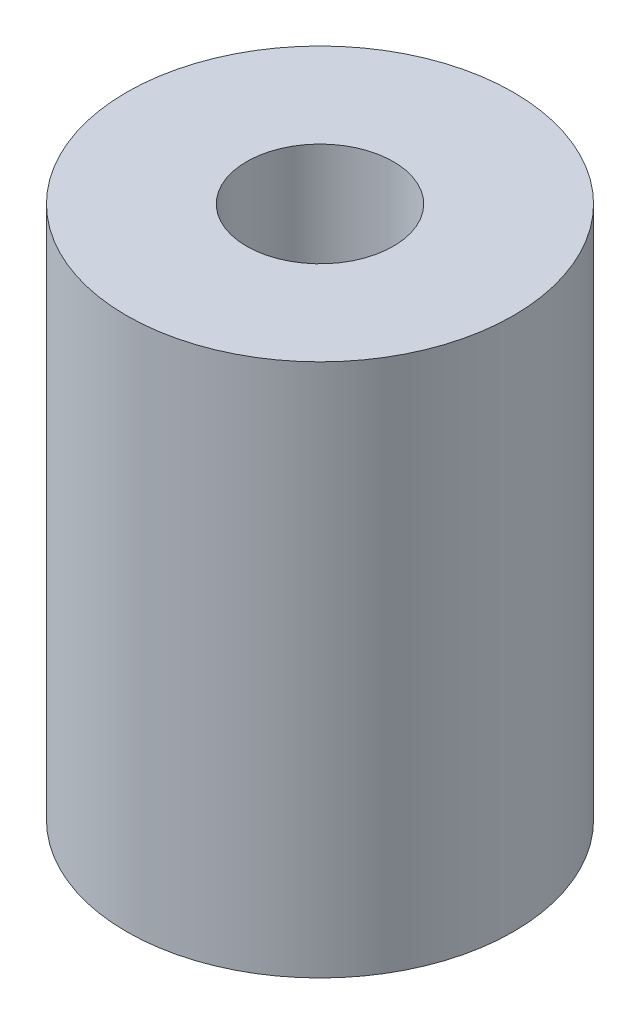
ISO-10303-21;
HEADER;
FILE_DESCRIPTION(('STEP AP214'),'2;1');
FILE_NAME('part.step','',(''),(''),'','','');
FILE_SCHEMA(('AUTOMOTIVE_DESIGN { 1 0 10303 214 1 1 1 1 }'));
ENDSEC;
DATA;
#1=APPLICATION_CONTEXT('core data for automotive mechanical design processes');
#2=APPLICATION_PROTOCOL_DEFINITION('international standard','automotive_design',2000,#1);
#3=PRODUCT_CONTEXT('',#1,'mechanical');
#4=PRODUCT('Part','Part','',(#3));
#5=PRODUCT_RELATED_PRODUCT_CATEGORY('part','',(#4));
#6=PRODUCT_DEFINITION_FORMATION('','',#4);
#7=PRODUCT_DEFINITION_CONTEXT('part definition',#1,'design');
#8=PRODUCT_DEFINITION('design','',#6,#7);
#9=PRODUCT_DEFINITION_SHAPE('','',#8);
#10=(LENGTH_UNIT() NAMED_UNIT(*) SI_UNIT(.MILLI.,.METRE.));
#11=(NAMED_UNIT(*) PLANE_ANGLE_UNIT() SI_UNIT($,.RADIAN.));
#12=(NAMED_UNIT(*) SI_UNIT($,.STERADIAN.) SOLID_ANGLE_UNIT());
#13=UNCERTAINTY_MEASURE_WITH_UNIT(LENGTH_MEASURE(1.E-05),#10,'distance_accuracy_value','');
#14=(GEOMETRIC_REPRESENTATION_CONTEXT(3) GLOBAL_UNCERTAINTY_ASSIGNED_CONTEXT((#13)) GLOBAL_UNIT_ASSIGNED_CONTEXT((#10,
#11,#12)) REPRESENTATION_CONTEXT('',''));
#15=CARTESIAN_POINT('',(0.,0.,0.));
#16=DIRECTION('',(0.,0.,1.));
#17=DIRECTION('',(1.,0.,0.));
#18=AXIS2_PLACEMENT_3D('',#15,#16,#17);
#19=CARTESIAN_POINT('',(0.,8.,0.));
#20=DIRECTION('',(0.,1.,0.));
#21=DIRECTION('',(0.,0.,1.));
#22=AXIS2_PLACEMENT_3D('',#19,#20,#21);
#23=PLANE('',#22);
#24=CARTESIAN_POINT('',(0.,8.,0.));
#25=DIRECTION('',(0.,1.,0.));
#26=DIRECTION('',(0.,0.,1.));
#27=AXIS2_PLACEMENT_3D('',#24,#25,#26);
#28=CIRCLE('',#27,2.9);
#29=CARTESIAN_POINT('',(0.,8.,2.9));
#30=VERTEX_POINT('',#29);
#31=EDGE_CURVE('E10',#30,#30,#28,.T.);
#32=ORIENTED_EDGE('',*,*,#31,.T.);
#33=EDGE_LOOP('',(#32));
#34=FACE_BOUND('',#33,.T.);
#35=CARTESIAN_POINT('',(0.,8.,0.));
#36=DIRECTION('',(0.,1.,0.));
#37=DIRECTION('',(0.,0.,1.));
#38=AXIS2_PLACEMENT_3D('',#35,#36,#37);
#39=CIRCLE('',#38,1.1);
#40=CARTESIAN_POINT('',(0.,8.,1.1));
#41=VERTEX_POINT('',#40);
#42=EDGE_CURVE('E55',#41,#41,#39,.T.);
#43=ORIENTED_EDGE('',*,*,#42,.F.);
#44=EDGE_LOOP('',(#43));
#45=FACE_BOUND('',#44,.T.);
#46=ADVANCED_FACE('F41',(#34,#45),#23,.T.);
#47=CARTESIAN_POINT('',(0.,0.,0.));
#48=DIRECTION('',(0.,1.,0.));
#49=DIRECTION('',(0.,0.,1.));
#50=AXIS2_PLACEMENT_3D('',#47,#48,#49);
#51=PLANE('',#50);
#52=CARTESIAN_POINT('',(0.,0.,0.));
#53=DIRECTION('',(0.,1.,0.));
#54=DIRECTION('',(0.,0.,1.));
#55=AXIS2_PLACEMENT_3D('',#52,#53,#54);
#56=CIRCLE('',#55,2.9);
#57=CARTESIAN_POINT('',(0.,0.,2.9));
#58=VERTEX_POINT('',#57);
#59=EDGE_CURVE('E45',#58,#58,#56,.T.);
#60=ORIENTED_EDGE('',*,*,#59,.F.);
#61=EDGE_LOOP('',(#60));
#62=FACE_BOUND('',#61,.T.);
#63=CARTESIAN_POINT('',(0.,0.,0.));
#64=DIRECTION('',(0.,1.,0.));
#65=DIRECTION('',(0.,0.,1.));
#66=AXIS2_PLACEMENT_3D('',#63,#64,#65);
#67=CIRCLE('',#66,1.1);
#68=CARTESIAN_POINT('',(0.,0.,1.1));
#69=VERTEX_POINT('',#68);
#70=EDGE_CURVE('E57',#69,#69,#67,.T.);
#71=ORIENTED_EDGE('',*,*,#70,.T.);
#72=EDGE_LOOP('',(#71));
#73=FACE_BOUND('',#72,.T.);
#74=ADVANCED_FACE('F68',(#62,#73),#51,.F.);
#75=CARTESIAN_POINT('',(0.,8.,0.));
#76=DIRECTION('',(0.,-1.,0.));
#77=DIRECTION('',(0.,0.,-1.));
#78=AXIS2_PLACEMENT_3D('',#75,#76,#77);
#79=CYLINDRICAL_SURFACE('',#78,2.9);
#80=ORIENTED_EDGE('',*,*,#31,.F.);
#81=EDGE_LOOP('',(#80));
#82=FACE_BOUND('',#81,.T.);
#83=ORIENTED_EDGE('',*,*,#59,.T.);
#84=EDGE_LOOP('',(#83));
#85=FACE_BOUND('',#84,.T.);
#86=ADVANCED_FACE('F43',(#82,#85),#79,.T.);
#87=CARTESIAN_POINT('',(0.,8.,0.));
#88=DIRECTION('',(0.,-1.,0.));
#89=DIRECTION('',(0.,0.,-1.));
#90=AXIS2_PLACEMENT_3D('',#87,#88,#89);
#91=CYLINDRICAL_SURFACE('',#90,1.1);
#92=ORIENTED_EDGE('',*,*,#42,.T.);
#93=EDGE_LOOP('',(#92));
#94=FACE_BOUND('',#93,.T.);
#95=ORIENTED_EDGE('',*,*,#70,.F.);
#96=EDGE_LOOP('',(#95));
#97=FACE_BOUND('',#96,.T.);
#98=ADVANCED_FACE('F64',(#94,#97),#91,.F.);
#99=CLOSED_SHELL('',(#46,#74,#86,#98));
#100=MANIFOLD_SOLID_BREP('B2',#99);
#101=ADVANCED_BREP_SHAPE_REPRESENTATION('',(#18,#100),#14);
#102=SHAPE_DEFINITION_REPRESENTATION(#9,#101);
ENDSEC;
END-ISO-10303-21;
